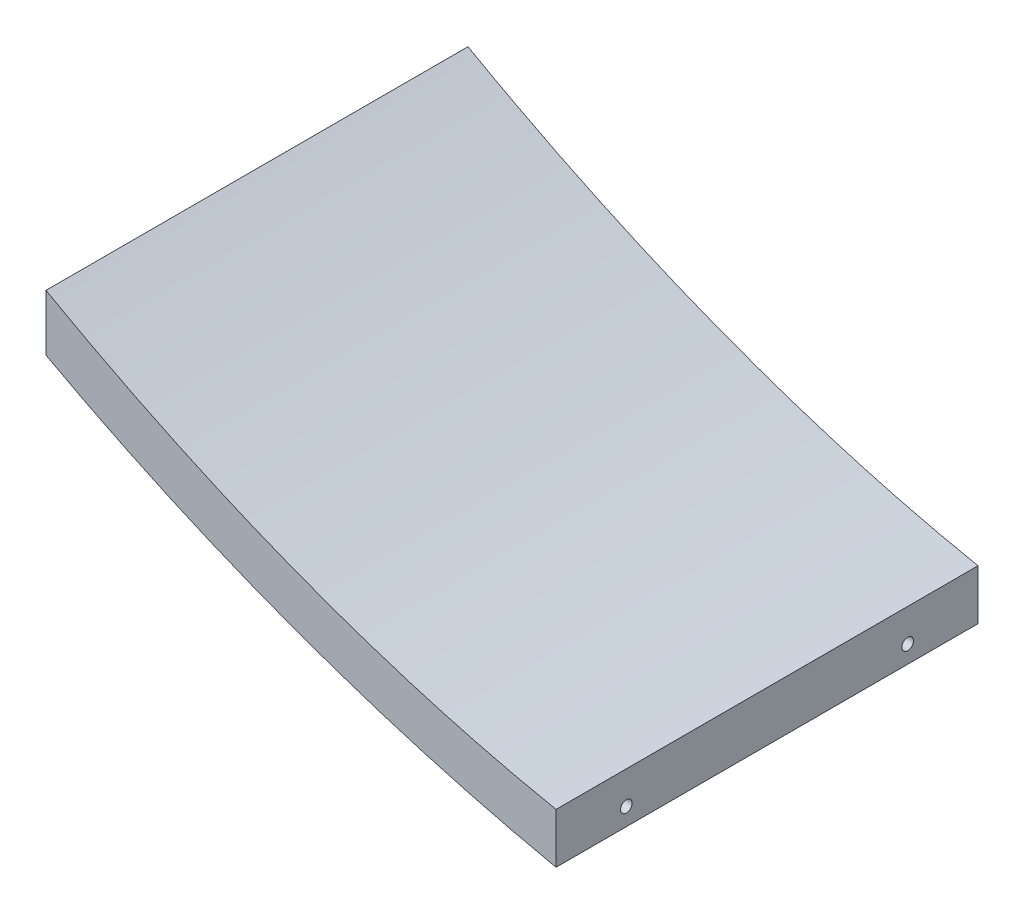
ISO-10303-21;
HEADER;
FILE_DESCRIPTION(('STEP AP214'),'2;1');
FILE_NAME('part.step','',(''),(''),'','','');
FILE_SCHEMA(('AUTOMOTIVE_DESIGN { 1 0 10303 214 1 1 1 1 }'));
ENDSEC;
DATA;
#1=APPLICATION_CONTEXT('core data for automotive mechanical design processes');
#2=APPLICATION_PROTOCOL_DEFINITION('international standard','automotive_design',2000,#1);
#3=PRODUCT_CONTEXT('',#1,'mechanical');
#4=PRODUCT('Part','Part','',(#3));
#5=PRODUCT_RELATED_PRODUCT_CATEGORY('part','',(#4));
#6=PRODUCT_DEFINITION_FORMATION('','',#4);
#7=PRODUCT_DEFINITION_CONTEXT('part definition',#1,'design');
#8=PRODUCT_DEFINITION('design','',#6,#7);
#9=PRODUCT_DEFINITION_SHAPE('','',#8);
#10=(LENGTH_UNIT() NAMED_UNIT(*) SI_UNIT(.MILLI.,.METRE.));
#11=(NAMED_UNIT(*) PLANE_ANGLE_UNIT() SI_UNIT($,.RADIAN.));
#12=(NAMED_UNIT(*) SI_UNIT($,.STERADIAN.) SOLID_ANGLE_UNIT());
#13=UNCERTAINTY_MEASURE_WITH_UNIT(LENGTH_MEASURE(1.E-05),#10,'distance_accuracy_value','');
#14=(GEOMETRIC_REPRESENTATION_CONTEXT(3) GLOBAL_UNCERTAINTY_ASSIGNED_CONTEXT((#13)) GLOBAL_UNIT_ASSIGNED_CONTEXT((#10,
#11,#12)) REPRESENTATION_CONTEXT('',''));
#15=CARTESIAN_POINT('',(0.,0.,0.));
#16=DIRECTION('',(0.,0.,1.));
#17=DIRECTION('',(1.,0.,0.));
#18=AXIS2_PLACEMENT_3D('',#15,#16,#17);
#19=CARTESIAN_POINT('',(-80.2000000000161,-6.24458010022783E-12,-280.868409042393));
#20=DIRECTION('',(-1.,0.,0.));
#21=DIRECTION('',(0.,-1.,0.));
#22=AXIS2_PLACEMENT_3D('',#19,#20,#21);
#23=PLANE('',#22);
#24=CARTESIAN_POINT('',(-80.2000000000004,-201.728635759915,-100.));
#25=DIRECTION('',(1.,0.,0.));
#26=DIRECTION('',(0.,1.,0.));
#27=AXIS2_PLACEMENT_3D('',#24,#25,#26);
#28=CIRCLE('',#27,1.65000000000002);
#29=CARTESIAN_POINT('',(-80.2000000000005,-200.078635759915,-100.));
#30=VERTEX_POINT('',#29);
#31=EDGE_CURVE('E191',#30,#30,#28,.T.);
#32=ORIENTED_EDGE('',*,*,#31,.F.);
#33=EDGE_LOOP('',(#32));
#34=FACE_BOUND('',#33,.T.);
#35=CARTESIAN_POINT('',(-80.2000000000004,-201.728635759916,-20.));
#36=DIRECTION('',(1.,0.,0.));
#37=DIRECTION('',(0.,-1.,0.));
#38=AXIS2_PLACEMENT_3D('',#35,#36,#37);
#39=CIRCLE('',#38,1.65000000000002);
#40=CARTESIAN_POINT('',(-80.2000000000003,-203.378635759916,-20.));
#41=VERTEX_POINT('',#40);
#42=EDGE_CURVE('E195',#41,#41,#39,.T.);
#43=ORIENTED_EDGE('',*,*,#42,.F.);
#44=EDGE_LOOP('',(#43));
#45=FACE_BOUND('',#44,.T.);
#46=DIRECTION('',(0.,0.,1.));
#47=VECTOR('',#46,1.);
#48=CARTESIAN_POINT('',(-80.2,-206.728635759915,-280.868409042393));
#49=LINE('',#48,#47);
#50=CARTESIAN_POINT('',(-80.2,-206.728635759915,-120.));
#51=VERTEX_POINT('',#50);
#52=CARTESIAN_POINT('',(-80.2,-206.728635759915,0.));
#53=VERTEX_POINT('',#52);
#54=EDGE_CURVE('E124',#51,#53,#49,.T.);
#55=ORIENTED_EDGE('',*,*,#54,.F.);
#56=DIRECTION('',(0.,1.,0.));
#57=VECTOR('',#56,1.);
#58=CARTESIAN_POINT('',(-80.2000000000161,-6.24458010022783E-12,-120.));
#59=LINE('',#58,#57);
#60=CARTESIAN_POINT('',(-80.2000000000011,-192.46988895135,-120.));
#61=VERTEX_POINT('',#60);
#62=EDGE_CURVE('E138',#51,#61,#59,.T.);
#63=ORIENTED_EDGE('',*,*,#62,.T.);
#64=DIRECTION('',(0.,0.,1.));
#65=VECTOR('',#64,1.);
#66=CARTESIAN_POINT('',(-80.2000000000011,-192.46988895135,-280.868409042393));
#67=LINE('',#66,#65);
#68=CARTESIAN_POINT('',(-80.2000000000011,-192.46988895135,0.));
#69=VERTEX_POINT('',#68);
#70=EDGE_CURVE('E129',#61,#69,#67,.T.);
#71=ORIENTED_EDGE('',*,*,#70,.T.);
#72=DIRECTION('',(0.,-1.,0.));
#73=VECTOR('',#72,1.);
#74=CARTESIAN_POINT('',(-80.2000000000161,-6.24458010022783E-12,0.));
#75=LINE('',#74,#73);
#76=EDGE_CURVE('E199',#69,#53,#75,.T.);
#77=ORIENTED_EDGE('',*,*,#76,.T.);
#78=EDGE_LOOP('',(#55,#63,#71,#77));
#79=FACE_BOUND('',#78,.T.);
#80=ADVANCED_FACE('F39',(#34,#45,#79),#23,.F.);
#81=CARTESIAN_POINT('',(32.130359110305,320.401888418334,-280.868409042393));
#82=DIRECTION('',(0.,0.,1.));
#83=DIRECTION('',(1.,0.,0.));
#84=AXIS2_PLACEMENT_3D('',#81,#82,#83);
#85=CYLINDRICAL_SURFACE('',#84,538.966324642167);
#86=DIRECTION('',(0.,0.,1.));
#87=VECTOR('',#86,1.);
#88=CARTESIAN_POINT('',(-90.2000000000002,-204.498085232103,-280.868409042393));
#89=LINE('',#88,#87);
#90=CARTESIAN_POINT('',(-90.2000000000002,-204.498085232103,-98.8466788734258));
#91=VERTEX_POINT('',#90);
#92=CARTESIAN_POINT('',(-90.2000000000002,-204.498085232103,-101.153321126574));
#93=VERTEX_POINT('',#92);
#94=EDGE_CURVE('E95',#91,#93,#89,.F.);
#95=ORIENTED_EDGE('',*,*,#94,.T.);
#96=CARTESIAN_POINT('',(-90.2000000000002,-204.498085232103,-101.153321126574));
#97=CARTESIAN_POINT('',(-90.2638445270703,-204.483206045612,-101.189019573077));
#98=CARTESIAN_POINT('',(-90.328428246267,-204.468142160153,-101.223277145664));
#99=CARTESIAN_POINT('',(-90.4587696188836,-204.437714766339,-101.289274754626));
#100=CARTESIAN_POINT('',(-90.5245267924078,-204.42235138024,-101.321015792511));
#101=CARTESIAN_POINT('',(-90.6568714379526,-204.391403965745,-101.382330474219));
#102=CARTESIAN_POINT('',(-90.7234576492375,-204.375820268415,-101.411907027401));
#103=CARTESIAN_POINT('',(-90.857380301003,-204.344450095666,-101.46921136134));
#104=CARTESIAN_POINT('',(-90.9247168276096,-204.328663596936,-101.496938927253));
#105=CARTESIAN_POINT('',(-91.1271295528526,-204.281168042047,-101.577487358757));
#106=CARTESIAN_POINT('',(-91.2631066543495,-204.249206543324,-101.627899905383));
#107=CARTESIAN_POINT('',(-91.5367787514077,-204.184765907049,-101.723584518062));
#108=CARTESIAN_POINT('',(-91.6744744396074,-204.152286559225,-101.768854432021));
#109=CARTESIAN_POINT('',(-91.9506802139167,-204.087019810301,-101.854975410898));
#110=CARTESIAN_POINT('',(-92.0891865560855,-204.054233644512,-101.895839479817));
#111=CARTESIAN_POINT('',(-92.3671115164281,-203.988328216435,-101.973929569115));
#112=CARTESIAN_POINT('',(-92.5065299869184,-203.955209007626,-102.011156163613));
#113=CARTESIAN_POINT('',(-92.7862706703598,-203.888637339413,-102.082492732934));
#114=CARTESIAN_POINT('',(-92.9265937780147,-203.855184522895,-102.116598852072));
#115=CARTESIAN_POINT('',(-93.2078361056759,-203.788016889204,-102.182004518555));
#116=CARTESIAN_POINT('',(-93.3487553611079,-203.754302056357,-102.213303896585));
#117=CARTESIAN_POINT('',(-93.7589809889798,-203.655980217566,-102.300608288917));
#118=CARTESIAN_POINT('',(-94.0289206871747,-203.591062534902,-102.353301473118));
#119=CARTESIAN_POINT('',(-94.5700246040607,-203.460487933601,-102.450983993751));
#120=CARTESIAN_POINT('',(-94.8411889518393,-203.39483093589,-102.495972497633));
#121=CARTESIAN_POINT('',(-95.384478476345,-203.262835867523,-102.579209275462));
#122=CARTESIAN_POINT('',(-95.6566039417305,-203.196497578352,-102.617455310578));
#123=CARTESIAN_POINT('',(-96.201497076808,-203.06321307019,-102.687856643516));
#124=CARTESIAN_POINT('',(-96.4742647730785,-202.9962668257,-102.720011684614));
#125=CARTESIAN_POINT('',(-97.2938856707443,-202.794423472737,-102.808154626302));
#126=CARTESIAN_POINT('',(-97.8414473452207,-202.658669770339,-102.855729526977));
#127=CARTESIAN_POINT('',(-98.9372894774085,-202.385151900469,-102.93070794673));
#128=CARTESIAN_POINT('',(-99.4855697641934,-202.247388152083,-102.958115610998));
#129=CARTESIAN_POINT('',(-100.58628619797,-201.968971963681,-102.99367282149));
#130=CARTESIAN_POINT('',(-101.138723450698,-201.828305774415,-103.001680250478));
#131=CARTESIAN_POINT('',(-102.243189307996,-201.545210034,-102.997735136598));
#132=CARTESIAN_POINT('',(-102.795217839696,-201.402780224084,-102.985779629391));
#133=CARTESIAN_POINT('',(-103.621864855884,-201.188097791311,-102.951785203491));
#134=CARTESIAN_POINT('',(-103.896978770651,-201.116417293581,-102.937793097839));
#135=CARTESIAN_POINT('',(-104.446765396025,-200.97270712073,-102.904139244915));
#136=CARTESIAN_POINT('',(-104.721438119551,-200.90067745609,-102.884477666803));
#137=CARTESIAN_POINT('',(-105.270135922461,-200.756325104647,-102.839072951068));
#138=CARTESIAN_POINT('',(-105.544161139995,-200.684002491391,-102.813331256906));
#139=CARTESIAN_POINT('',(-106.091429270551,-200.539102895642,-102.755196528022));
#140=CARTESIAN_POINT('',(-106.364672220819,-200.466525925639,-102.722803815515));
#141=CARTESIAN_POINT('',(-106.90574649089,-200.322354876427,-102.651179120922));
#142=CARTESIAN_POINT('',(-107.173594154218,-200.250763767923,-102.612065546065));
#143=CARTESIAN_POINT('',(-107.707995648942,-200.107487258655,-102.525645226675));
#144=CARTESIAN_POINT('',(-107.974549282966,-200.035801845503,-102.478337270297));
#145=CARTESIAN_POINT('',(-108.504596639418,-199.892819716089,-102.37435575184));
#146=CARTESIAN_POINT('',(-108.768098777337,-199.821522720044,-102.317725957248));
#147=CARTESIAN_POINT('',(-109.292394263383,-199.679237617429,-102.192930231224));
#148=CARTESIAN_POINT('',(-109.553188391725,-199.608249425517,-102.124767726243));
#149=CARTESIAN_POINT('',(-110.025521448597,-199.479303484336,-101.98690822382));
#150=CARTESIAN_POINT('',(-110.237703576914,-199.421236507946,-101.919560974009));
#151=CARTESIAN_POINT('',(-110.553149310436,-199.33470592171,-101.808671267128));
#152=CARTESIAN_POINT('',(-110.658025709923,-199.30590250084,-101.76997920498));
#153=CARTESIAN_POINT('',(-110.866370423739,-199.248615384126,-101.688778779697));
#154=CARTESIAN_POINT('',(-110.9698389532,-199.220131639553,-101.64627100734));
#155=CARTESIAN_POINT('',(-111.175915042757,-199.163335992555,-101.556308327868));
#156=CARTESIAN_POINT('',(-111.278505014776,-199.135028311158,-101.508810155698));
#157=CARTESIAN_POINT('',(-111.481084556929,-199.079067320187,-101.408227142543));
#158=CARTESIAN_POINT('',(-111.581074908813,-199.051413814123,-101.355144005867));
#159=CARTESIAN_POINT('',(-111.776962444607,-198.997179917499,-101.242201675702));
#160=CARTESIAN_POINT('',(-111.872873751204,-198.970595845178,-101.182369024696));
#161=CARTESIAN_POINT('',(-112.058931770528,-198.918972657565,-101.053851680375));
#162=CARTESIAN_POINT('',(-112.149088902307,-198.893930752944,-100.985183707058));
#163=CARTESIAN_POINT('',(-112.296806409911,-198.852863280483,-100.856257247063));
#164=CARTESIAN_POINT('',(-112.356580943786,-198.836232920977,-100.798759881029));
#165=CARTESIAN_POINT('',(-112.468345638651,-198.80511944374,-100.676056848932));
#166=CARTESIAN_POINT('',(-112.520351598167,-198.790631968747,-100.610867323225));
#167=CARTESIAN_POINT('',(-112.596453670561,-198.769422197259,-100.495212586112));
#168=CARTESIAN_POINT('',(-112.624034692942,-198.761732406829,-100.447247283689));
#169=CARTESIAN_POINT('',(-112.671825538959,-198.748404882678,-100.347481903346));
#170=CARTESIAN_POINT('',(-112.692046758164,-198.742763976589,-100.29568790451));
#171=CARTESIAN_POINT('',(-112.720542767794,-198.734813722843,-100.197602534105));
#172=CARTESIAN_POINT('',(-112.730209791333,-198.732116160194,-100.151753577598));
#173=CARTESIAN_POINT('',(-112.741883223013,-198.728858637875,-100.059020317938));
#174=CARTESIAN_POINT('',(-112.743895811794,-198.728296953573,-100.012136880867));
#175=CARTESIAN_POINT('',(-112.740040399362,-198.729372870166,-99.9187292761437));
#176=CARTESIAN_POINT('',(-112.73417221446,-198.731010522324,-99.8722051168904));
#177=CARTESIAN_POINT('',(-112.715199320985,-198.73630454655,-99.7807765374818));
#178=CARTESIAN_POINT('',(-112.702087224218,-198.739962979648,-99.7358738209605));
#179=CARTESIAN_POINT('',(-112.66355137456,-198.750712575157,-99.6316545810276));
#180=CARTESIAN_POINT('',(-112.635328925344,-198.758583692257,-99.5734650884694));
#181=CARTESIAN_POINT('',(-112.570486083103,-198.77666047215,-99.4623813403952));
#182=CARTESIAN_POINT('',(-112.533844746015,-198.786871957025,-99.4095007716456));
#183=CARTESIAN_POINT('',(-112.459143434905,-198.807680242692,-99.3143503141428));
#184=CARTESIAN_POINT('',(-112.421692673551,-198.818108378292,-99.2715542152419));
#185=CARTESIAN_POINT('',(-112.343385779746,-198.839902839934,-99.1894266286797));
#186=CARTESIAN_POINT('',(-112.30252675708,-198.851269962157,-99.1500981409005));
#187=CARTESIAN_POINT('',(-112.218193899311,-198.87472020513,-99.0743979691047));
#188=CARTESIAN_POINT('',(-112.17471415261,-198.886804943631,-99.0380334409561));
#189=CARTESIAN_POINT('',(-112.085841262204,-198.911493633061,-98.9679692582231));
#190=CARTESIAN_POINT('',(-112.04044878956,-198.924097401858,-98.9342686807557));
#191=CARTESIAN_POINT('',(-111.92423052029,-198.95634977808,-98.8522804800783));
#192=CARTESIAN_POINT('',(-111.852422544292,-198.976262267532,-98.8054911037029));
#193=CARTESIAN_POINT('',(-111.706324101789,-199.016741809671,-98.7162471434651));
#194=CARTESIAN_POINT('',(-111.632032352989,-199.037309200193,-98.6737948460421));
#195=CARTESIAN_POINT('',(-111.406187109823,-199.099779871656,-98.5517123552983));
#196=CARTESIAN_POINT('',(-111.251896431735,-199.142387024274,-98.4775122792029));
#197=CARTESIAN_POINT('',(-110.938274541837,-199.228837991207,-98.3393869277686));
#198=CARTESIAN_POINT('',(-110.778922036902,-199.272686911534,-98.2755147168985));
#199=CARTESIAN_POINT('',(-110.537816053669,-199.338910288935,-98.1860050799785));
#200=CARTESIAN_POINT('',(-110.457144024334,-199.361048024033,-98.1572317511853));
#201=CARTESIAN_POINT('',(-110.295191070306,-199.405449739849,-98.1015596777538));
#202=CARTESIAN_POINT('',(-110.213910150203,-199.427713719614,-98.0746609190052));
#203=CARTESIAN_POINT('',(-109.981572221844,-199.491295326832,-98.0004149159717));
#204=CARTESIAN_POINT('',(-109.829894557402,-199.532732843972,-97.9551073417807));
#205=CARTESIAN_POINT('',(-109.525218737512,-199.615824086109,-97.8693713033762));
#206=CARTESIAN_POINT('',(-109.372220411181,-199.657477838798,-97.8289434810186));
#207=CARTESIAN_POINT('',(-108.911577614812,-199.782667679955,-97.7139308624963));
#208=CARTESIAN_POINT('',(-108.602405618907,-199.866399427443,-97.6456540261306));
#209=CARTESIAN_POINT('',(-107.980845132972,-200.034134040111,-97.522202115874));
#210=CARTESIAN_POINT('',(-107.668451075734,-200.118137097149,-97.4670561048312));
#211=CARTESIAN_POINT('',(-107.041963402983,-200.285992064599,-97.3678377254849));
#212=CARTESIAN_POINT('',(-106.727870199972,-200.36984400564,-97.3237627827365));
#213=CARTESIAN_POINT('',(-106.097665461011,-200.53747360937,-97.2450554770192));
#214=CARTESIAN_POINT('',(-105.781550870081,-200.621250591369,-97.2104464209636));
#215=CARTESIAN_POINT('',(-105.148395623684,-200.788431728582,-97.1497505266693));
#216=CARTESIAN_POINT('',(-104.831354919379,-200.871835863526,-97.123664146371));
#217=CARTESIAN_POINT('',(-104.196984253242,-201.038100407292,-97.0792888776183));
#218=CARTESIAN_POINT('',(-103.879655048084,-201.120961332732,-97.0609910205821));
#219=CARTESIAN_POINT('',(-103.244531506954,-201.286184824152,-97.0316206628983));
#220=CARTESIAN_POINT('',(-102.92673716392,-201.368547382467,-97.0205482731019));
#221=CARTESIAN_POINT('',(-102.259438622349,-201.5408398038,-97.0045132906278));
#222=CARTESIAN_POINT('',(-101.909902853049,-201.630713554325,-97.0002622234773));
#223=CARTESIAN_POINT('',(-101.210643660432,-201.809760568687,-96.9997612892826));
#224=CARTESIAN_POINT('',(-100.860920234756,-201.898933823486,-97.0035115252988));
#225=CARTESIAN_POINT('',(-100.161351102039,-202.076563562226,-97.0189102045641));
#226=CARTESIAN_POINT('',(-99.811505390353,-202.165019818268,-97.0305610665326));
#227=CARTESIAN_POINT('',(-99.1119742538106,-202.341145126648,-97.0618317543408));
#228=CARTESIAN_POINT('',(-98.762288827443,-202.428814186561,-97.0814515034225));
#229=CARTESIAN_POINT('',(-98.0657394442253,-202.602703301239,-97.1287514341816));
#230=CARTESIAN_POINT('',(-97.7188730295468,-202.688929219422,-97.1563736048637));
#231=CARTESIAN_POINT('',(-97.0257162553199,-202.860507288782,-97.2202070027166));
#232=CARTESIAN_POINT('',(-96.6794258842594,-202.945859457602,-97.2564180561117));
#233=CARTESIAN_POINT('',(-95.9876332233873,-203.115643304932,-97.3382161250071));
#234=CARTESIAN_POINT('',(-95.6421311419235,-203.200074758352,-97.3838053814118));
#235=CARTESIAN_POINT('',(-94.9524306872129,-203.367898369584,-97.4855479229246));
#236=CARTESIAN_POINT('',(-94.6082322248108,-203.451290599397,-97.5417004717891));
#237=CARTESIAN_POINT('',(-94.0912426517787,-203.576010282667,-97.6356926604933));
#238=CARTESIAN_POINT('',(-93.9177097824831,-203.61778217456,-97.6688895948905));
#239=CARTESIAN_POINT('',(-93.571293846296,-203.700988185378,-97.7388531487427));
#240=CARTESIAN_POINT('',(-93.3984107307617,-203.742422329871,-97.7756194952178));
#241=CARTESIAN_POINT('',(-93.0536987790816,-203.824858429294,-97.8531307912935));
#242=CARTESIAN_POINT('',(-92.8818688078331,-203.86586090695,-97.8938701133561));
#243=CARTESIAN_POINT('',(-92.5392287306569,-203.947445500968,-97.9799985175601));
#244=CARTESIAN_POINT('',(-92.3684188485968,-203.988027526398,-98.0253885833371));
#245=CARTESIAN_POINT('',(-92.0268710920082,-204.068999557266,-98.1220474607145));
#246=CARTESIAN_POINT('',(-91.8561445999095,-204.109385466948,-98.1733601661293));
#247=CARTESIAN_POINT('',(-91.5167983224333,-204.189485801954,-98.2827843273134));
#248=CARTESIAN_POINT('',(-91.3481774103879,-204.229200590792,-98.3408919580733));
#249=CARTESIAN_POINT('',(-91.0971761621366,-204.288192573024,-98.4347419160186));
#250=CARTESIAN_POINT('',(-91.0136513141006,-204.307801857873,-98.4672179181101));
#251=CARTESIAN_POINT('',(-90.8475918714353,-204.346746588907,-98.534730621161));
#252=CARTESIAN_POINT('',(-90.7650571042478,-204.36608208292,-98.5697668681267));
#253=CARTESIAN_POINT('',(-90.6010815404841,-204.404456495745,-98.6429058792212));
#254=CARTESIAN_POINT('',(-90.519643056516,-204.423494798065,-98.6810142096862));
#255=CARTESIAN_POINT('',(-90.3584369617283,-204.461142129663,-98.7609191997187));
#256=CARTESIAN_POINT('',(-90.2786703985186,-204.479750890492,-98.8027180910243));
#257=CARTESIAN_POINT('',(-90.2000000000002,-204.498085232103,-98.846678873426));
#258=B_SPLINE_CURVE_WITH_KNOTS('',3,(#96,#97,#98,#99,#100,#101,#102,#103,#104,#105,#106,#107,
#108,#109,#110,#111,#112,#113,#114,#115,#116,#117,#118,#119,#120,#121,#122,#123,#124,#125,#126,
#127,#128,#129,#130,#131,#132,#133,#134,#135,#136,#137,#138,#139,#140,#141,#142,#143,#144,#145,
#146,#147,#148,#149,#150,#151,#152,#153,#154,#155,#156,#157,#158,#159,#160,#161,#162,#163,#164,
#165,#166,#167,#168,#169,#170,#171,#172,#173,#174,#175,#176,#177,#178,#179,#180,#181,#182,#183,
#184,#185,#186,#187,#188,#189,#190,#191,#192,#193,#194,#195,#196,#197,#198,#199,#200,#201,#202,
#203,#204,#205,#206,#207,#208,#209,#210,#211,#212,#213,#214,#215,#216,#217,#218,#219,#220,#221,
#222,#223,#224,#225,#226,#227,#228,#229,#230,#231,#232,#233,#234,#235,#236,#237,#238,#239,#240,
#241,#242,#243,#244,#245,#246,#247,#248,#249,#250,#251,#252,#253,#254,#255,#256,#257),
.UNSPECIFIED.,.F.,.F.,(4,2,2,2,2,2,2,2,2,2,2,2,2,2,2,2,2,2,2,2,2,2,2,2,2,2,2,2,2,2,2,2,2,2,2,2,
2,2,2,2,2,2,2,2,2,2,2,2,2,2,2,2,2,2,2,2,2,2,2,2,2,2,2,2,2,2,2,2,2,2,2,2,2,2,2,2,2,2,2,2,4),(0.,
0.223888494815896,0.44768743634781,0.671179816088924,0.894698119585812,1.34005988282528,
1.78560734016781,2.22980150895303,2.67392545501175,3.11859095537277,3.56328326163117,
4.41091514325841,5.2586385602176,6.10664293480394,6.95468304317004,8.65266261902625,
10.3502930931148,12.0603225235017,13.7706059024597,14.6244885615432,15.4783457458927,
16.3320004221775,17.1856137521627,18.0254949030482,18.8655003680343,19.7016688386711,
20.5375893124707,21.2274301017235,21.5736856358293,21.9198876520732,22.269387254326,
22.6187805108417,22.9668447616781,23.3142597643166,23.5675609227394,23.8203397304442,
23.9874281857617,24.1542568174631,24.2944395045464,24.434508975848,24.5745817120141,
24.7147975753099,24.9091397746991,25.1039707858865,25.2771697215123,25.4505170533156,
25.6242712099133,25.7979649059421,26.0617315012705,26.3256364403101,26.8543048644798,
27.3856087342678,27.6509825677092,27.9163544033901,28.4071508129608,28.8980117090195,
29.8801233183415,30.8643888686479,31.8484253274057,32.8348633052459,33.8213542776491,
34.8067061999549,35.7920732389194,36.8747702086714,37.9574811241467,39.0405236534803,
40.1235557509825,41.1989252202884,42.2742729338824,43.3498778989303,44.4254079238757,
44.9700303566835,45.5146111708607,46.0584315157416,46.6023671173657,47.1506298075747,
47.6985853413333,47.973762108698,48.2488901983814,48.5245285108388,48.8003346627645),.UNSPECIFIED.);
#259=EDGE_CURVE('E11',#93,#91,#258,.T.);
#260=ORIENTED_EDGE('',*,*,#259,.T.);
#261=EDGE_LOOP('',(#95,#260));
#262=FACE_BOUND('',#261,.T.);
#263=DIRECTION('',(0.,0.,1.));
#264=VECTOR('',#263,1.);
#265=CARTESIAN_POINT('',(-90.2000000000002,-204.498085232103,-280.868409042393));
#266=LINE('',#265,#264);
#267=CARTESIAN_POINT('',(-90.2000000000002,-204.498085232103,-18.8466788734247));
#268=VERTEX_POINT('',#267);
#269=CARTESIAN_POINT('',(-90.2000000000002,-204.498085232103,-21.1533211265752));
#270=VERTEX_POINT('',#269);
#271=EDGE_CURVE('E111',#268,#270,#266,.F.);
#272=ORIENTED_EDGE('',*,*,#271,.T.);
#273=CARTESIAN_POINT('',(-90.2000000000002,-204.498085232103,-21.1533211265752));
#274=CARTESIAN_POINT('',(-90.2638445270703,-204.483206045612,-21.1890195730781));
#275=CARTESIAN_POINT('',(-90.3284282462672,-204.468142160153,-21.2232771456655));
#276=CARTESIAN_POINT('',(-90.4587696188841,-204.437714766339,-21.2892747546275));
#277=CARTESIAN_POINT('',(-90.5245267924085,-204.42235138024,-21.3210157925118));
#278=CARTESIAN_POINT('',(-90.6568714379536,-204.391403965745,-21.3823304742201));
#279=CARTESIAN_POINT('',(-90.7234576492387,-204.375820268415,-21.4119070274018));
#280=CARTESIAN_POINT('',(-90.8573803010044,-204.344450095666,-21.469211361341));
#281=CARTESIAN_POINT('',(-90.9247168276111,-204.328663596935,-21.4969389272541));
#282=CARTESIAN_POINT('',(-91.1271295528544,-204.281168042047,-21.5774873587584));
#283=CARTESIAN_POINT('',(-91.2631066543518,-204.249206543323,-21.6278999053846));
#284=CARTESIAN_POINT('',(-91.5367787514106,-204.184765907048,-21.7235845180633));
#285=CARTESIAN_POINT('',(-91.6744744396106,-204.152286559224,-21.7688544320224));
#286=CARTESIAN_POINT('',(-91.9506802139204,-204.0870198103,-21.8549754109));
#287=CARTESIAN_POINT('',(-92.0891865560894,-204.054233644511,-21.8958394798188));
#288=CARTESIAN_POINT('',(-92.3671115164326,-203.988328216433,-21.9739295691171));
#289=CARTESIAN_POINT('',(-92.5065299869234,-203.955209007625,-22.0111561636149));
#290=CARTESIAN_POINT('',(-92.7862706703654,-203.888637339412,-22.0824927329355));
#291=CARTESIAN_POINT('',(-92.9265937780205,-203.855184522894,-22.116598852074));
#292=CARTESIAN_POINT('',(-93.2078361056823,-203.788016889202,-22.1820045185565));
#293=CARTESIAN_POINT('',(-93.3487553611146,-203.754302056355,-22.2133038965872));
#294=CARTESIAN_POINT('',(-93.7589809889872,-203.655980217564,-22.3006082889186));
#295=CARTESIAN_POINT('',(-94.0289206871825,-203.5910625349,-22.3533014731198));
#296=CARTESIAN_POINT('',(-94.5700246040694,-203.460487933599,-22.4509839937524));
#297=CARTESIAN_POINT('',(-94.8411889518484,-203.394830935888,-22.4959724976349));
#298=CARTESIAN_POINT('',(-95.384478476355,-203.26283586752,-22.5792092754634));
#299=CARTESIAN_POINT('',(-95.6566039417408,-203.196497578349,-22.61745531058));
#300=CARTESIAN_POINT('',(-96.2014970768191,-203.063213070187,-22.6878566435176));
#301=CARTESIAN_POINT('',(-96.4742647730901,-202.996266825697,-22.7200116846151));
#302=CARTESIAN_POINT('',(-97.2938856707572,-202.794423472734,-22.808154626303));
#303=CARTESIAN_POINT('',(-97.8414473452344,-202.658669770336,-22.8557295269783));
#304=CARTESIAN_POINT('',(-98.9372894774238,-202.385151900465,-22.9307079467307));
#305=CARTESIAN_POINT('',(-99.4855697642095,-202.247388152079,-22.9581156109992));
#306=CARTESIAN_POINT('',(-100.586286197988,-201.968971963676,-22.9936728214901));
#307=CARTESIAN_POINT('',(-101.138723450716,-201.82830577441,-23.0016802504777));
#308=CARTESIAN_POINT('',(-102.243189308015,-201.545210033995,-22.9977351365975));
#309=CARTESIAN_POINT('',(-102.795217839716,-201.402780224079,-22.98577962939));
#310=CARTESIAN_POINT('',(-103.621864855906,-201.188097791306,-22.9517852034895));
#311=CARTESIAN_POINT('',(-103.896978770673,-201.116417293575,-22.9377930978382));
#312=CARTESIAN_POINT('',(-104.446765396048,-200.972707120724,-22.9041392449137));
#313=CARTESIAN_POINT('',(-104.721438119574,-200.900677456084,-22.8844776668011));
#314=CARTESIAN_POINT('',(-105.270135922484,-200.756325104641,-22.8390729510657));
#315=CARTESIAN_POINT('',(-105.544161140019,-200.684002491385,-22.8133312569034));
#316=CARTESIAN_POINT('',(-106.091429270575,-200.539102895635,-22.7551965280192));
#317=CARTESIAN_POINT('',(-106.364672220844,-200.466525925632,-22.7228038155117));
#318=CARTESIAN_POINT('',(-106.905746490916,-200.32235487642,-22.6511791209186));
#319=CARTESIAN_POINT('',(-107.173594154244,-200.250763767916,-22.6120655460604));
#320=CARTESIAN_POINT('',(-107.707995648969,-200.107487258648,-22.5256452266702));
#321=CARTESIAN_POINT('',(-107.974549282992,-200.035801845496,-22.4783372702921));
#322=CARTESIAN_POINT('',(-108.504596639446,-199.892819716082,-22.374355751834));
#323=CARTESIAN_POINT('',(-108.768098777365,-199.821522720037,-22.3177259572414));
#324=CARTESIAN_POINT('',(-109.292394263412,-199.679237617421,-22.1929302312159));
#325=CARTESIAN_POINT('',(-109.553188391753,-199.608249425509,-22.1247677262346));
#326=CARTESIAN_POINT('',(-110.025521448617,-199.479303484331,-21.9869082238136));
#327=CARTESIAN_POINT('',(-110.237703576925,-199.421236507943,-21.919560974005));
#328=CARTESIAN_POINT('',(-110.553149310433,-199.334705921711,-21.808671267128));
#329=CARTESIAN_POINT('',(-110.658025709915,-199.305902500842,-21.7699792049816));
#330=CARTESIAN_POINT('',(-110.866370423723,-199.24861538413,-21.6887787797022));
#331=CARTESIAN_POINT('',(-110.969838953179,-199.220131639558,-21.6462710073477));
#332=CARTESIAN_POINT('',(-111.175915042727,-199.163335992563,-21.5563083278809));
#333=CARTESIAN_POINT('',(-111.278505014743,-199.135028311167,-21.5088101557132));
#334=CARTESIAN_POINT('',(-111.481084556886,-199.079067320199,-21.4082271425639));
#335=CARTESIAN_POINT('',(-111.581074908767,-199.051413814136,-21.3551440058916));
#336=CARTESIAN_POINT('',(-111.776962444554,-198.997179917514,-21.2422016757341));
#337=CARTESIAN_POINT('',(-111.872873751147,-198.970595845193,-21.1823690247313));
#338=CARTESIAN_POINT('',(-112.058931770466,-198.918972657583,-21.0538516804204));
#339=CARTESIAN_POINT('',(-112.149088902241,-198.893930752963,-20.9851837071081));
#340=CARTESIAN_POINT('',(-112.296806409851,-198.8528632805,-20.8562572471172));
#341=CARTESIAN_POINT('',(-112.356580943732,-198.836232920992,-20.7987598810809));
#342=CARTESIAN_POINT('',(-112.46834563861,-198.805119443751,-20.6760568489784));
#343=CARTESIAN_POINT('',(-112.520351598133,-198.790631968756,-20.6108673232684));
#344=CARTESIAN_POINT('',(-112.596453670536,-198.769422197266,-20.495212586152));
#345=CARTESIAN_POINT('',(-112.62403469292,-198.761732406836,-20.4472472837281));
#346=CARTESIAN_POINT('',(-112.671825538942,-198.748404882683,-20.3474819033848));
#347=CARTESIAN_POINT('',(-112.692046758149,-198.742763976593,-20.2956879045479));
#348=CARTESIAN_POINT('',(-112.720542767783,-198.734813722846,-20.1976025341417));
#349=CARTESIAN_POINT('',(-112.730209791324,-198.732116160196,-20.1517535776354));
#350=CARTESIAN_POINT('',(-112.741883223009,-198.728858637876,-20.0590203179748));
#351=CARTESIAN_POINT('',(-112.743895811792,-198.728296953574,-20.0121368809036));
#352=CARTESIAN_POINT('',(-112.740040399363,-198.729372870165,-19.9187292761786));
#353=CARTESIAN_POINT('',(-112.734172214463,-198.731010522323,-19.8722051169245));
#354=CARTESIAN_POINT('',(-112.715199320992,-198.736304546548,-19.7807765375139));
#355=CARTESIAN_POINT('',(-112.702087224226,-198.739962979645,-19.7358738209915));
#356=CARTESIAN_POINT('',(-112.663551374572,-198.750712575153,-19.6316545810594));
#357=CARTESIAN_POINT('',(-112.635328925359,-198.758583692253,-19.5734650885028));
#358=CARTESIAN_POINT('',(-112.570486083125,-198.776660472144,-19.4623813404313));
#359=CARTESIAN_POINT('',(-112.53384474604,-198.786871957018,-19.4095007716829));
#360=CARTESIAN_POINT('',(-112.459143434937,-198.807680242683,-19.3143503141831));
#361=CARTESIAN_POINT('',(-112.421692673587,-198.818108378282,-19.271554215284));
#362=CARTESIAN_POINT('',(-112.343385779791,-198.839902839921,-19.1894266287251));
#363=CARTESIAN_POINT('',(-112.302526757129,-198.851269962144,-19.1500981409475));
#364=CARTESIAN_POINT('',(-112.218193899368,-198.874720205114,-19.0743979691546));
#365=CARTESIAN_POINT('',(-112.174714152672,-198.886804943614,-19.0380334410076));
#366=CARTESIAN_POINT('',(-112.085841262274,-198.911493633042,-18.9679692582771));
#367=CARTESIAN_POINT('',(-112.040448789634,-198.924097401837,-18.9342686808109));
#368=CARTESIAN_POINT('',(-111.924230520377,-198.956349778056,-18.8522804801377));
#369=CARTESIAN_POINT('',(-111.852422544387,-198.976262267506,-18.805491103765));
#370=CARTESIAN_POINT('',(-111.706324101902,-199.01674180964,-18.7162471435326));
#371=CARTESIAN_POINT('',(-111.632032353112,-199.037309200159,-18.6737948461122));
#372=CARTESIAN_POINT('',(-111.406187109973,-199.099779871614,-18.551712355375));
#373=CARTESIAN_POINT('',(-111.251896431903,-199.142387024228,-18.4775122792827));
#374=CARTESIAN_POINT('',(-110.938274542042,-199.22883799115,-18.3393869278541));
#375=CARTESIAN_POINT('',(-110.778922037125,-199.272686911472,-18.2755147169866));
#376=CARTESIAN_POINT('',(-110.53781605392,-199.338910288866,-18.1860050800698));
#377=CARTESIAN_POINT('',(-110.457144024593,-199.361048023962,-18.1572317512774));
#378=CARTESIAN_POINT('',(-110.295191070585,-199.405449739772,-18.1015596778476));
#379=CARTESIAN_POINT('',(-110.213910150491,-199.427713719535,-18.0746609190997));
#380=CARTESIAN_POINT('',(-109.98157222216,-199.491295326746,-18.0004149160689));
#381=CARTESIAN_POINT('',(-109.829894557737,-199.532732843881,-17.9551073418796));
#382=CARTESIAN_POINT('',(-109.525218737886,-199.615824086007,-17.8693713034778));
#383=CARTESIAN_POINT('',(-109.372220411574,-199.657477838691,-17.8289434811212));
#384=CARTESIAN_POINT('',(-108.911577615263,-199.782667679832,-17.7139308626012));
#385=CARTESIAN_POINT('',(-108.602405619397,-199.86639942731,-17.6456540262362));
#386=CARTESIAN_POINT('',(-107.98084513354,-200.034134039958,-17.5222021159792));
#387=CARTESIAN_POINT('',(-107.668451076341,-200.118137096986,-17.4670561049353));
#388=CARTESIAN_POINT('',(-107.041963403667,-200.285992064416,-17.3678377255857));
#389=CARTESIAN_POINT('',(-106.727870200695,-200.369844005447,-17.3237627828349));
#390=CARTESIAN_POINT('',(-106.097665461811,-200.537473609158,-17.2450554771116));
#391=CARTESIAN_POINT('',(-105.781550870921,-200.621250591147,-17.2104464210522));
#392=CARTESIAN_POINT('',(-105.148395624602,-200.78843172834,-17.1497505267494));
#393=CARTESIAN_POINT('',(-104.831354920335,-200.871835863274,-17.1236641464462));
#394=CARTESIAN_POINT('',(-104.196984254276,-201.038100407021,-17.0792888776826));
#395=CARTESIAN_POINT('',(-103.879655049157,-201.120961332452,-17.0609910206403));
#396=CARTESIAN_POINT('',(-103.244531508104,-201.286184823853,-17.0316206629431));
#397=CARTESIAN_POINT('',(-102.926737165109,-201.368547382159,-17.0205482731394));
#398=CARTESIAN_POINT('',(-102.259438623554,-201.54083980349,-17.004513290647));
#399=CARTESIAN_POINT('',(-101.90990285423,-201.630713554022,-17.000262223487));
#400=CARTESIAN_POINT('',(-101.210643661565,-201.809760568397,-16.9997612892745));
#401=CARTESIAN_POINT('',(-100.860920235866,-201.898933823203,-17.0035115252825));
#402=CARTESIAN_POINT('',(-100.161351103102,-202.076563561957,-17.0189102045324));
#403=CARTESIAN_POINT('',(-99.8115053913918,-202.165019818006,-17.0305610664938));
#404=CARTESIAN_POINT('',(-99.1119742548016,-202.3411451264,-17.0618317542886));
#405=CARTESIAN_POINT('',(-98.7622888284101,-202.428814186318,-17.0814515033641));
#406=CARTESIAN_POINT('',(-98.0657394451443,-202.60270330101,-17.1287514341116));
#407=CARTESIAN_POINT('',(-97.7188730304416,-202.688929219199,-17.1563736047883));
#408=CARTESIAN_POINT('',(-97.0257162561664,-202.860507288573,-17.2202070026312));
#409=CARTESIAN_POINT('',(-96.6794258850817,-202.945859457399,-17.2564180560215));
#410=CARTESIAN_POINT('',(-95.987633224161,-203.115643304742,-17.338216124908));
#411=CARTESIAN_POINT('',(-95.6421311426728,-203.200074758169,-17.3838053813085));
#412=CARTESIAN_POINT('',(-94.9524306879132,-203.367898369414,-17.4855479228134));
#413=CARTESIAN_POINT('',(-94.6082322254865,-203.451290599233,-17.541700471674));
#414=CARTESIAN_POINT('',(-94.091242652402,-203.576010282517,-17.6356926603754));
#415=CARTESIAN_POINT('',(-93.9177097830789,-203.617782174417,-17.6688895947739));
#416=CARTESIAN_POINT('',(-93.5712938468366,-203.700988185248,-17.7388531486291));
#417=CARTESIAN_POINT('',(-93.3984107312747,-203.742422329748,-17.775619495106));
#418=CARTESIAN_POINT('',(-93.0536987795396,-203.824858429185,-17.8531307911861));
#419=CARTESIAN_POINT('',(-92.8818688082636,-203.865860906848,-17.8938701132513));
#420=CARTESIAN_POINT('',(-92.5392287310327,-203.947445500879,-17.9799985174613));
#421=CARTESIAN_POINT('',(-92.3684188489452,-203.988027526315,-18.0253885832417));
#422=CARTESIAN_POINT('',(-92.0268710923017,-204.068999557196,-18.1220474606272));
#423=CARTESIAN_POINT('',(-91.8561446001756,-204.109385466885,-18.1733601660466));
#424=CARTESIAN_POINT('',(-91.5167983226446,-204.189485801905,-18.282784327241));
#425=CARTESIAN_POINT('',(-91.348177410572,-204.229200590748,-18.3408919580068));
#426=CARTESIAN_POINT('',(-91.0971761622803,-204.28819257299,-18.4347419159624));
#427=CARTESIAN_POINT('',(-91.0136513142308,-204.307801857842,-18.4672179180576));
#428=CARTESIAN_POINT('',(-90.8475918715388,-204.346746588883,-18.5347306211167));
#429=CARTESIAN_POINT('',(-90.765057104338,-204.366082082898,-18.5697668680868));
#430=CARTESIAN_POINT('',(-90.6010815405479,-204.40445649573,-18.6429058791907));
#431=CARTESIAN_POINT('',(-90.5196430565667,-204.423494798053,-18.6810142096607));
#432=CARTESIAN_POINT('',(-90.3584369617532,-204.461142129657,-18.7609191997044));
#433=CARTESIAN_POINT('',(-90.2786703985309,-204.479750890489,-18.8027180910162));
#434=CARTESIAN_POINT('',(-90.2000000000002,-204.498085232103,-18.8466788734248));
#435=B_SPLINE_CURVE_WITH_KNOTS('',3,(#273,#274,#275,#276,#277,#278,#279,#280,#281,#282,#283,
#284,#285,#286,#287,#288,#289,#290,#291,#292,#293,#294,#295,#296,#297,#298,#299,#300,#301,#302,
#303,#304,#305,#306,#307,#308,#309,#310,#311,#312,#313,#314,#315,#316,#317,#318,#319,#320,#321,
#322,#323,#324,#325,#326,#327,#328,#329,#330,#331,#332,#333,#334,#335,#336,#337,#338,#339,#340,
#341,#342,#343,#344,#345,#346,#347,#348,#349,#350,#351,#352,#353,#354,#355,#356,#357,#358,#359,
#360,#361,#362,#363,#364,#365,#366,#367,#368,#369,#370,#371,#372,#373,#374,#375,#376,#377,#378,
#379,#380,#381,#382,#383,#384,#385,#386,#387,#388,#389,#390,#391,#392,#393,#394,#395,#396,#397,
#398,#399,#400,#401,#402,#403,#404,#405,#406,#407,#408,#409,#410,#411,#412,#413,#414,#415,#416,
#417,#418,#419,#420,#421,#422,#423,#424,#425,#426,#427,#428,#429,#430,#431,#432,#433,#434),
.UNSPECIFIED.,.F.,.F.,(4,2,2,2,2,2,2,2,2,2,2,2,2,2,2,2,2,2,2,2,2,2,2,2,2,2,2,2,2,2,2,2,2,2,2,2,
2,2,2,2,2,2,2,2,2,2,2,2,2,2,2,2,2,2,2,2,2,2,2,2,2,2,2,2,2,2,2,2,2,2,2,2,2,2,2,2,2,2,2,2,4),(0.,
0.223888494816332,0.447687436348682,0.671179816090252,0.894698119587564,1.34005988282789,
1.78560734017131,2.22980150895744,2.67392545501705,3.11859095537898,3.5632832616383,
4.4109151432668,5.25863856022724,6.10664293481485,6.95468304318221,8.65266261904096,
10.350293093132,12.0603225235212,13.7706059024815,14.6244885615661,15.4783457459167,
16.3320004222026,17.1856137521889,18.0254949030754,18.8655003680625,19.7016688387008,
20.5375893125017,21.2274301017255,21.5736856358163,21.9198876520453,22.2693872542822,
22.618780510782,22.9668447616032,23.3142597642267,23.5675609226696,23.8203397303943,
23.9874281857164,24.1542568174223,24.2944395045072,24.4345089758104,24.5745817119783,
24.7147975752758,24.9091397746566,25.1039707858354,25.2771697214486,25.4505170532393,
25.6242712098242,25.7979649058401,26.0617315011408,26.3256364401526,26.8543048642663,
27.3856087339983,27.6509825674118,27.9163544030648,28.4071508125766,28.8980117085763,
29.8801233177804,30.8643888679686,31.8484253266083,32.8348633043298,33.8213542766144,
34.8067061988017,35.7920732376478,36.8747702074733,37.957481123022,39.0405236524292,
40.1235557500049,41.1989252193844,42.2742729330518,43.3498778981732,44.4254079231922,
44.9700303560845,45.5146111703462,46.0584315153114,46.6023671170199,47.150629807314,
47.6985853411578,47.9737621085653,48.2488901982915,48.5245285107919,48.8003346627607),.UNSPECIFIED.);
#436=EDGE_CURVE('E52',#270,#268,#435,.T.);
#437=ORIENTED_EDGE('',*,*,#436,.T.);
#438=EDGE_LOOP('',(#272,#437));
#439=FACE_BOUND('',#438,.T.);
#440=DIRECTION('',(0.,0.,1.));
#441=VECTOR('',#440,1.);
#442=CARTESIAN_POINT('',(-225.245130619814,-153.140671848922,-280.868409042393));
#443=LINE('',#442,#441);
#444=CARTESIAN_POINT('',(-225.245130619814,-153.140671848922,-120.));
#445=VERTEX_POINT('',#444);
#446=CARTESIAN_POINT('',(-225.245130619814,-153.140671848922,0.));
#447=VERTEX_POINT('',#446);
#448=EDGE_CURVE('E115',#445,#447,#443,.T.);
#449=ORIENTED_EDGE('',*,*,#448,.F.);
#450=CARTESIAN_POINT('',(32.130359110305,320.401888418334,-120.));
#451=DIRECTION('',(0.,0.,1.));
#452=DIRECTION('',(1.,0.,0.));
#453=AXIS2_PLACEMENT_3D('',#450,#451,#452);
#454=CIRCLE('',#453,538.966324642167);
#455=EDGE_CURVE('E116',#445,#51,#454,.T.);
#456=ORIENTED_EDGE('',*,*,#455,.T.);
#457=ORIENTED_EDGE('',*,*,#54,.T.);
#458=CARTESIAN_POINT('',(32.130359110305,320.401888418334,0.));
#459=DIRECTION('',(0.,0.,1.));
#460=DIRECTION('',(1.,0.,0.));
#461=AXIS2_PLACEMENT_3D('',#458,#459,#460);
#462=CIRCLE('',#461,538.966324642167);
#463=EDGE_CURVE('E119',#53,#447,#462,.F.);
#464=ORIENTED_EDGE('',*,*,#463,.T.);
#465=EDGE_LOOP('',(#449,#456,#457,#464));
#466=FACE_BOUND('',#465,.T.);
#467=ADVANCED_FACE('F104',(#262,#439,#466),#85,.T.);
#468=CARTESIAN_POINT('',(-225.245130619814,0.,-280.868409042393));
#469=DIRECTION('',(-1.,0.,0.));
#470=DIRECTION('',(0.,0.,1.));
#471=AXIS2_PLACEMENT_3D('',#468,#469,#470);
#472=PLANE('',#471);
#473=DIRECTION('',(0.,1.,0.));
#474=VECTOR('',#473,1.);
#475=CARTESIAN_POINT('',(-225.245130619814,0.,-120.));
#476=LINE('',#475,#474);
#477=CARTESIAN_POINT('',(-225.245130619814,-137.154537768553,-120.));
#478=VERTEX_POINT('',#477);
#479=EDGE_CURVE('E127',#445,#478,#476,.T.);
#480=ORIENTED_EDGE('',*,*,#479,.F.);
#481=ORIENTED_EDGE('',*,*,#448,.T.);
#482=DIRECTION('',(0.,-1.,0.));
#483=VECTOR('',#482,1.);
#484=CARTESIAN_POINT('',(-225.245130619814,0.,0.));
#485=LINE('',#484,#483);
#486=CARTESIAN_POINT('',(-225.245130619814,-137.154537768553,0.));
#487=VERTEX_POINT('',#486);
#488=EDGE_CURVE('E202',#487,#447,#485,.T.);
#489=ORIENTED_EDGE('',*,*,#488,.F.);
#490=DIRECTION('',(0.,0.,1.));
#491=VECTOR('',#490,1.);
#492=CARTESIAN_POINT('',(-225.245130619814,-137.154537768553,-280.868409042393));
#493=LINE('',#492,#491);
#494=EDGE_CURVE('E125',#478,#487,#493,.T.);
#495=ORIENTED_EDGE('',*,*,#494,.F.);
#496=EDGE_LOOP('',(#480,#481,#489,#495));
#497=FACE_BOUND('',#496,.T.);
#498=ADVANCED_FACE('F107',(#497),#472,.T.);
#499=CARTESIAN_POINT('',(225.245130619819,-137.154537768551,-280.868409042393));
#500=CARTESIAN_POINT('',(222.908176032963,-138.469074723657,-280.868409042393));
#501=CARTESIAN_POINT('',(218.204067638301,-141.073902870022,-280.868409042393));
#502=CARTESIAN_POINT('',(208.827276173067,-146.100944940152,-280.868409042393));
#503=CARTESIAN_POINT('',(197.095113633908,-152.081763048424,-280.868409042393));
#504=CARTESIAN_POINT('',(183.020628450954,-158.761564513527,-280.868409042393));
#505=CARTESIAN_POINT('',(164.252323786066,-167.009400213228,-280.868409042393));
#506=CARTESIAN_POINT('',(140.791197461168,-176.082259845335,-280.868409042393));
#507=CARTESIAN_POINT('',(112.635650998168,-184.990896120192,-280.868409042393));
#508=CARTESIAN_POINT('',(84.4784352769144,-191.920233494286,-280.868409042393));
#509=CARTESIAN_POINT('',(46.9335816501066,-198.519950199364,-280.868409042393));
#510=CARTESIAN_POINT('',(3.53883589099269E-13,-201.820033200405,-280.868409042393));
#511=CARTESIAN_POINT('',(-46.9335816501035,-198.519950199365,-280.868409042393));
#512=CARTESIAN_POINT('',(-84.4784352769108,-191.920233494286,-280.868409042393));
#513=CARTESIAN_POINT('',(-112.635650998168,-184.990896120193,-280.868409042393));
#514=CARTESIAN_POINT('',(-140.791197461162,-176.082259845337,-280.868409042393));
#515=CARTESIAN_POINT('',(-164.252323786063,-167.009400213228,-280.868409042393));
#516=CARTESIAN_POINT('',(-183.020628450953,-158.761564513527,-280.868409042393));
#517=CARTESIAN_POINT('',(-197.0951136339,-152.081763048426,-280.868409042393));
#518=CARTESIAN_POINT('',(-208.827276173062,-146.100944940152,-280.868409042393));
#519=CARTESIAN_POINT('',(-218.204067638298,-141.073902870023,-280.868409042393));
#520=CARTESIAN_POINT('',(-222.90817603296,-138.469074723659,-280.868409042393));
#521=CARTESIAN_POINT('',(-225.245130619814,-137.154537768553,-280.868409042393));
#522=B_SPLINE_CURVE_WITH_KNOTS('',3,(#499,#500,#501,#502,#503,#504,#505,#506,#507,#508,#509,
#510,#511,#512,#513,#514,#515,#516,#517,#518,#519,#520,#521),.UNSPECIFIED.,.F.,.F.,(4,1,1,1,1,1,
1,1,1,1,1,1,1,1,1,1,1,1,1,1,4),(0.496022524355826,0.496146820469706,0.496271116583587,
0.496519708811347,0.496768301039108,0.497016893266869,0.497514077722391,0.498011262177913,
0.498508446633435,0.499005631088956,0.5,0.500994368911044,0.501491553366565,0.501988737822087,
0.502485922277609,0.502983106733131,0.503231698960892,0.503480291188652,0.503728883416413,
0.503853179530294,0.503977475644174),.UNSPECIFIED.);
#523=DIRECTION('',(0.,0.,1.));
#524=VECTOR('',#523,1.);
#525=SURFACE_OF_LINEAR_EXTRUSION('',#522,#524);
#526=CARTESIAN_POINT('',(225.245130619819,-137.154537768551,-120.));
#527=CARTESIAN_POINT('',(222.908176032963,-138.469074723657,-120.));
#528=CARTESIAN_POINT('',(218.204067638301,-141.073902870022,-120.));
#529=CARTESIAN_POINT('',(208.827276173067,-146.100944940152,-120.));
#530=CARTESIAN_POINT('',(197.095113633908,-152.081763048424,-120.));
#531=CARTESIAN_POINT('',(183.020628450954,-158.761564513527,-120.));
#532=CARTESIAN_POINT('',(164.252323786066,-167.009400213228,-120.));
#533=CARTESIAN_POINT('',(140.791197461168,-176.082259845335,-120.));
#534=CARTESIAN_POINT('',(112.635650998168,-184.990896120192,-120.));
#535=CARTESIAN_POINT('',(84.4784352769144,-191.920233494286,-120.));
#536=CARTESIAN_POINT('',(46.9335816501066,-198.519950199364,-120.));
#537=CARTESIAN_POINT('',(3.53883589099269E-13,-201.820033200405,-120.));
#538=CARTESIAN_POINT('',(-46.9335816501035,-198.519950199365,-120.));
#539=CARTESIAN_POINT('',(-84.4784352769108,-191.920233494286,-120.));
#540=CARTESIAN_POINT('',(-112.635650998168,-184.990896120193,-120.));
#541=CARTESIAN_POINT('',(-140.791197461162,-176.082259845337,-120.));
#542=CARTESIAN_POINT('',(-164.252323786063,-167.009400213228,-120.));
#543=CARTESIAN_POINT('',(-183.020628450953,-158.761564513527,-120.));
#544=CARTESIAN_POINT('',(-197.0951136339,-152.081763048426,-120.));
#545=CARTESIAN_POINT('',(-208.827276173062,-146.100944940152,-120.));
#546=CARTESIAN_POINT('',(-218.204067638298,-141.073902870023,-120.));
#547=CARTESIAN_POINT('',(-222.90817603296,-138.469074723659,-120.));
#548=CARTESIAN_POINT('',(-225.245130619814,-137.154537768553,-120.));
#549=B_SPLINE_CURVE_WITH_KNOTS('',3,(#526,#527,#528,#529,#530,#531,#532,#533,#534,#535,#536,
#537,#538,#539,#540,#541,#542,#543,#544,#545,#546,#547,#548),.UNSPECIFIED.,.F.,.F.,(4,1,1,1,1,1,
1,1,1,1,1,1,1,1,1,1,1,1,1,1,4),(0.496022524355826,0.496146820469706,0.496271116583587,
0.496519708811347,0.496768301039108,0.497016893266869,0.497514077722391,0.498011262177913,
0.498508446633435,0.499005631088956,0.5,0.500994368911044,0.501491553366565,0.501988737822087,
0.502485922277609,0.502983106733131,0.503231698960892,0.503480291188652,0.503728883416413,
0.503853179530294,0.503977475644174),.UNSPECIFIED.);
#550=EDGE_CURVE('E134',#478,#61,#549,.F.);
#551=ORIENTED_EDGE('',*,*,#550,.F.);
#552=ORIENTED_EDGE('',*,*,#494,.T.);
#553=CARTESIAN_POINT('',(225.245130619819,-137.154537768551,0.));
#554=CARTESIAN_POINT('',(222.908176032963,-138.469074723657,0.));
#555=CARTESIAN_POINT('',(218.204067638301,-141.073902870022,0.));
#556=CARTESIAN_POINT('',(208.827276173067,-146.100944940152,0.));
#557=CARTESIAN_POINT('',(197.095113633908,-152.081763048424,0.));
#558=CARTESIAN_POINT('',(183.020628450954,-158.761564513527,0.));
#559=CARTESIAN_POINT('',(164.252323786066,-167.009400213228,0.));
#560=CARTESIAN_POINT('',(140.791197461168,-176.082259845335,0.));
#561=CARTESIAN_POINT('',(112.635650998168,-184.990896120192,0.));
#562=CARTESIAN_POINT('',(84.4784352769144,-191.920233494286,0.));
#563=CARTESIAN_POINT('',(46.9335816501066,-198.519950199364,0.));
#564=CARTESIAN_POINT('',(3.53883589099269E-13,-201.820033200405,0.));
#565=CARTESIAN_POINT('',(-46.9335816501035,-198.519950199365,0.));
#566=CARTESIAN_POINT('',(-84.4784352769108,-191.920233494286,0.));
#567=CARTESIAN_POINT('',(-112.635650998168,-184.990896120193,0.));
#568=CARTESIAN_POINT('',(-140.791197461162,-176.082259845337,0.));
#569=CARTESIAN_POINT('',(-164.252323786063,-167.009400213228,0.));
#570=CARTESIAN_POINT('',(-183.020628450953,-158.761564513527,0.));
#571=CARTESIAN_POINT('',(-197.0951136339,-152.081763048426,0.));
#572=CARTESIAN_POINT('',(-208.827276173062,-146.100944940152,0.));
#573=CARTESIAN_POINT('',(-218.204067638298,-141.073902870023,0.));
#574=CARTESIAN_POINT('',(-222.90817603296,-138.469074723659,0.));
#575=CARTESIAN_POINT('',(-225.245130619814,-137.154537768553,0.));
#576=B_SPLINE_CURVE_WITH_KNOTS('',3,(#553,#554,#555,#556,#557,#558,#559,#560,#561,#562,#563,
#564,#565,#566,#567,#568,#569,#570,#571,#572,#573,#574,#575),.UNSPECIFIED.,.F.,.F.,(4,1,1,1,1,1,
1,1,1,1,1,1,1,1,1,1,1,1,1,1,4),(0.496022524355826,0.496146820469706,0.496271116583587,
0.496519708811347,0.496768301039108,0.497016893266869,0.497514077722391,0.498011262177913,
0.498508446633435,0.499005631088956,0.5,0.500994368911044,0.501491553366565,0.501988737822087,
0.502485922277609,0.502983106733131,0.503231698960892,0.503480291188652,0.503728883416413,
0.503853179530294,0.503977475644174),.UNSPECIFIED.);
#577=EDGE_CURVE('E203',#69,#487,#576,.T.);
#578=ORIENTED_EDGE('',*,*,#577,.F.);
#579=ORIENTED_EDGE('',*,*,#70,.F.);
#580=EDGE_LOOP('',(#551,#552,#578,#579));
#581=FACE_BOUND('',#580,.T.);
#582=ADVANCED_FACE('F177',(#581),#525,.T.);
#583=CARTESIAN_POINT('',(0.,0.,0.));
#584=DIRECTION('',(0.,0.,1.));
#585=DIRECTION('',(1.,0.,0.));
#586=AXIS2_PLACEMENT_3D('',#583,#584,#585);
#587=PLANE('',#586);
#588=ORIENTED_EDGE('',*,*,#76,.F.);
#589=ORIENTED_EDGE('',*,*,#577,.T.);
#590=ORIENTED_EDGE('',*,*,#488,.T.);
#591=ORIENTED_EDGE('',*,*,#463,.F.);
#592=EDGE_LOOP('',(#588,#589,#590,#591));
#593=FACE_BOUND('',#592,.T.);
#594=ADVANCED_FACE('F174',(#593),#587,.T.);
#595=CARTESIAN_POINT('',(0.,-200.499999999989,-120.));
#596=DIRECTION('',(0.,0.,1.));
#597=DIRECTION('',(0.,1.,0.));
#598=AXIS2_PLACEMENT_3D('',#595,#596,#597);
#599=PLANE('',#598);
#600=ORIENTED_EDGE('',*,*,#455,.F.);
#601=ORIENTED_EDGE('',*,*,#479,.T.);
#602=ORIENTED_EDGE('',*,*,#550,.T.);
#603=ORIENTED_EDGE('',*,*,#62,.F.);
#604=EDGE_LOOP('',(#600,#601,#602,#603));
#605=FACE_BOUND('',#604,.T.);
#606=ADVANCED_FACE('F171',(#605),#599,.F.);
#607=CARTESIAN_POINT('',(-225.245130619815,-201.728635759927,-20.));
#608=DIRECTION('',(1.,0.,0.));
#609=DIRECTION('',(0.,1.,0.));
#610=AXIS2_PLACEMENT_3D('',#607,#608,#609);
#611=CYLINDRICAL_SURFACE('',#610,1.65000000000002);
#612=CARTESIAN_POINT('',(-90.2000000000004,-201.728635759917,-20.));
#613=DIRECTION('',(1.,0.,0.));
#614=DIRECTION('',(0.,1.,0.));
#615=AXIS2_PLACEMENT_3D('',#612,#613,#614);
#616=CIRCLE('',#615,1.65000000000002);
#617=CARTESIAN_POINT('',(-90.2000000000005,-200.078635759917,-20.));
#618=VERTEX_POINT('',#617);
#619=EDGE_CURVE('E98',#618,#618,#616,.F.);
#620=ORIENTED_EDGE('',*,*,#619,.T.);
#621=EDGE_LOOP('',(#620));
#622=FACE_BOUND('',#621,.T.);
#623=ORIENTED_EDGE('',*,*,#42,.T.);
#624=EDGE_LOOP('',(#623));
#625=FACE_BOUND('',#624,.T.);
#626=ADVANCED_FACE('F167',(#622,#625),#611,.F.);
#627=CARTESIAN_POINT('',(-225.245130619815,-201.728635759927,-100.));
#628=DIRECTION('',(1.,0.,0.));
#629=DIRECTION('',(0.,1.,0.));
#630=AXIS2_PLACEMENT_3D('',#627,#628,#629);
#631=CYLINDRICAL_SURFACE('',#630,1.65000000000002);
#632=CARTESIAN_POINT('',(-90.2000000000004,-201.728635759916,-100.));
#633=DIRECTION('',(1.,0.,0.));
#634=DIRECTION('',(0.,1.,0.));
#635=AXIS2_PLACEMENT_3D('',#632,#633,#634);
#636=CIRCLE('',#635,1.65000000000002);
#637=CARTESIAN_POINT('',(-90.2000000000005,-200.078635759916,-100.));
#638=VERTEX_POINT('',#637);
#639=EDGE_CURVE('E99',#638,#638,#636,.F.);
#640=ORIENTED_EDGE('',*,*,#639,.T.);
#641=EDGE_LOOP('',(#640));
#642=FACE_BOUND('',#641,.T.);
#643=ORIENTED_EDGE('',*,*,#31,.T.);
#644=EDGE_LOOP('',(#643));
#645=FACE_BOUND('',#644,.T.);
#646=ADVANCED_FACE('F164',(#642,#645),#631,.F.);
#647=CARTESIAN_POINT('',(-225.245130619814,-201.728635759927,-100.));
#648=DIRECTION('',(1.,0.,0.));
#649=DIRECTION('',(0.,1.,0.));
#650=AXIS2_PLACEMENT_3D('',#647,#648,#649);
#651=CYLINDRICAL_SURFACE('',#650,3.00000000000001);
#652=CARTESIAN_POINT('',(-90.2000000000004,-201.728635759916,-100.));
#653=DIRECTION('',(1.,0.,0.));
#654=DIRECTION('',(0.,1.,0.));
#655=AXIS2_PLACEMENT_3D('',#652,#653,#654);
#656=CIRCLE('',#655,3.00000000000001);
#657=EDGE_CURVE('E58',#93,#91,#656,.T.);
#658=ORIENTED_EDGE('',*,*,#657,.T.);
#659=ORIENTED_EDGE('',*,*,#259,.F.);
#660=EDGE_LOOP('',(#658,#659));
#661=FACE_BOUND('',#660,.T.);
#662=ADVANCED_FACE('F102',(#661),#651,.F.);
#663=CARTESIAN_POINT('',(-90.2000000000004,-201.728635759916,-100.));
#664=DIRECTION('',(1.,0.,0.));
#665=DIRECTION('',(0.,1.,0.));
#666=AXIS2_PLACEMENT_3D('',#663,#664,#665);
#667=PLANE('',#666);
#668=ORIENTED_EDGE('',*,*,#639,.F.);
#669=EDGE_LOOP('',(#668));
#670=FACE_BOUND('',#669,.T.);
#671=ORIENTED_EDGE('',*,*,#657,.F.);
#672=ORIENTED_EDGE('',*,*,#94,.F.);
#673=EDGE_LOOP('',(#671,#672));
#674=FACE_BOUND('',#673,.T.);
#675=ADVANCED_FACE('F96',(#670,#674),#667,.F.);
#676=CARTESIAN_POINT('',(-225.245130619814,-201.728635759927,-20.));
#677=DIRECTION('',(1.,0.,0.));
#678=DIRECTION('',(0.,1.,0.));
#679=AXIS2_PLACEMENT_3D('',#676,#677,#678);
#680=CYLINDRICAL_SURFACE('',#679,3.);
#681=CARTESIAN_POINT('',(-90.2000000000004,-201.728635759917,-20.));
#682=DIRECTION('',(1.,0.,0.));
#683=DIRECTION('',(0.,1.,0.));
#684=AXIS2_PLACEMENT_3D('',#681,#682,#683);
#685=CIRCLE('',#684,3.);
#686=EDGE_CURVE('E65',#270,#268,#685,.T.);
#687=ORIENTED_EDGE('',*,*,#686,.T.);
#688=ORIENTED_EDGE('',*,*,#436,.F.);
#689=EDGE_LOOP('',(#687,#688));
#690=FACE_BOUND('',#689,.T.);
#691=ADVANCED_FACE('F153',(#690),#680,.F.);
#692=CARTESIAN_POINT('',(-90.2000000000004,-201.728635759917,-20.));
#693=DIRECTION('',(1.,0.,0.));
#694=DIRECTION('',(0.,1.,0.));
#695=AXIS2_PLACEMENT_3D('',#692,#693,#694);
#696=PLANE('',#695);
#697=ORIENTED_EDGE('',*,*,#619,.F.);
#698=EDGE_LOOP('',(#697));
#699=FACE_BOUND('',#698,.T.);
#700=ORIENTED_EDGE('',*,*,#686,.F.);
#701=ORIENTED_EDGE('',*,*,#271,.F.);
#702=EDGE_LOOP('',(#700,#701));
#703=FACE_BOUND('',#702,.T.);
#704=ADVANCED_FACE('F157',(#699,#703),#696,.F.);
#705=CLOSED_SHELL('',(#80,#467,#498,#582,#594,#606,#626,#646,#662,#675,#691,#704));
#706=MANIFOLD_SOLID_BREP('B2',#705);
#707=ADVANCED_BREP_SHAPE_REPRESENTATION('',(#18,#706),#14);
#708=SHAPE_DEFINITION_REPRESENTATION(#9,#707);
ENDSEC;
END-ISO-10303-21;
